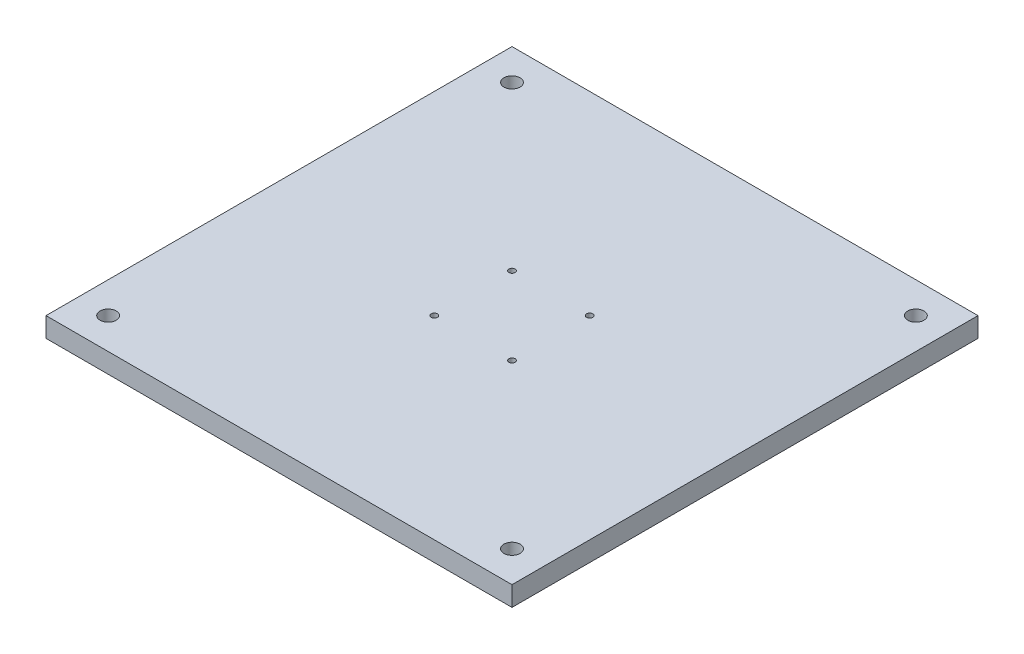
ISO-10303-21;
HEADER;
FILE_DESCRIPTION(('STEP AP214'),'2;1');
FILE_NAME('part.step','',(''),(''),'','','');
FILE_SCHEMA(('AUTOMOTIVE_DESIGN { 1 0 10303 214 1 1 1 1 }'));
ENDSEC;
DATA;
#1=APPLICATION_CONTEXT('core data for automotive mechanical design processes');
#2=APPLICATION_PROTOCOL_DEFINITION('international standard','automotive_design',2000,#1);
#3=PRODUCT_CONTEXT('',#1,'mechanical');
#4=PRODUCT('Part','Part','',(#3));
#5=PRODUCT_RELATED_PRODUCT_CATEGORY('part','',(#4));
#6=PRODUCT_DEFINITION_FORMATION('','',#4);
#7=PRODUCT_DEFINITION_CONTEXT('part definition',#1,'design');
#8=PRODUCT_DEFINITION('design','',#6,#7);
#9=PRODUCT_DEFINITION_SHAPE('','',#8);
#10=(LENGTH_UNIT() NAMED_UNIT(*) SI_UNIT(.MILLI.,.METRE.));
#11=(NAMED_UNIT(*) PLANE_ANGLE_UNIT() SI_UNIT($,.RADIAN.));
#12=(NAMED_UNIT(*) SI_UNIT($,.STERADIAN.) SOLID_ANGLE_UNIT());
#13=UNCERTAINTY_MEASURE_WITH_UNIT(LENGTH_MEASURE(1.E-05),#10,'distance_accuracy_value','');
#14=(GEOMETRIC_REPRESENTATION_CONTEXT(3) GLOBAL_UNCERTAINTY_ASSIGNED_CONTEXT((#13)) GLOBAL_UNIT_ASSIGNED_CONTEXT((#10,
#11,#12)) REPRESENTATION_CONTEXT('',''));
#15=CARTESIAN_POINT('',(0.,0.,0.));
#16=DIRECTION('',(0.,0.,1.));
#17=DIRECTION('',(1.,0.,0.));
#18=AXIS2_PLACEMENT_3D('',#15,#16,#17);
#19=CARTESIAN_POINT('',(0.,6.35,0.));
#20=DIRECTION('',(0.,1.,0.));
#21=DIRECTION('',(0.,0.,1.));
#22=AXIS2_PLACEMENT_3D('',#19,#20,#21);
#23=PLANE('',#22);
#24=CARTESIAN_POINT('',(12.5,6.35,12.5));
#25=DIRECTION('',(0.,1.,0.));
#26=DIRECTION('',(0.,0.,1.));
#27=AXIS2_PLACEMENT_3D('',#24,#25,#26);
#28=CIRCLE('',#27,1.00000000000001);
#29=CARTESIAN_POINT('',(12.5,6.35,13.5));
#30=VERTEX_POINT('',#29);
#31=EDGE_CURVE('E145',#30,#30,#28,.T.);
#32=ORIENTED_EDGE('',*,*,#31,.F.);
#33=EDGE_LOOP('',(#32));
#34=FACE_BOUND('',#33,.T.);
#35=CARTESIAN_POINT('',(-12.5,6.35,-12.5));
#36=DIRECTION('',(0.,1.,0.));
#37=DIRECTION('',(0.,0.,1.));
#38=AXIS2_PLACEMENT_3D('',#35,#36,#37);
#39=CIRCLE('',#38,0.999999999999998);
#40=CARTESIAN_POINT('',(-12.5,6.35,-11.5));
#41=VERTEX_POINT('',#40);
#42=EDGE_CURVE('E133',#41,#41,#39,.T.);
#43=ORIENTED_EDGE('',*,*,#42,.F.);
#44=EDGE_LOOP('',(#43));
#45=FACE_BOUND('',#44,.T.);
#46=CARTESIAN_POINT('',(65.,6.35,65.));
#47=DIRECTION('',(0.,1.,0.));
#48=DIRECTION('',(0.,0.,1.));
#49=AXIS2_PLACEMENT_3D('',#46,#47,#48);
#50=CIRCLE('',#49,2.59999999999999);
#51=CARTESIAN_POINT('',(65.,6.35,67.6));
#52=VERTEX_POINT('',#51);
#53=EDGE_CURVE('E121',#52,#52,#50,.T.);
#54=ORIENTED_EDGE('',*,*,#53,.F.);
#55=EDGE_LOOP('',(#54));
#56=FACE_BOUND('',#55,.T.);
#57=CARTESIAN_POINT('',(-65.,6.35,-65.));
#58=DIRECTION('',(0.,1.,0.));
#59=DIRECTION('',(0.,0.,1.));
#60=AXIS2_PLACEMENT_3D('',#57,#58,#59);
#61=CIRCLE('',#60,2.59999999999999);
#62=CARTESIAN_POINT('',(-65.,6.35,-62.4));
#63=VERTEX_POINT('',#62);
#64=EDGE_CURVE('E100',#63,#63,#61,.T.);
#65=ORIENTED_EDGE('',*,*,#64,.F.);
#66=EDGE_LOOP('',(#65));
#67=FACE_BOUND('',#66,.T.);
#68=DIRECTION('',(0.,0.,1.));
#69=VECTOR('',#68,1.);
#70=CARTESIAN_POINT('',(-75.,6.35,75.));
#71=LINE('',#70,#69);
#72=CARTESIAN_POINT('',(-75.,6.35,-75.));
#73=VERTEX_POINT('',#72);
#74=CARTESIAN_POINT('',(-75.,6.35,75.));
#75=VERTEX_POINT('',#74);
#76=EDGE_CURVE('E85',#73,#75,#71,.T.);
#77=ORIENTED_EDGE('',*,*,#76,.T.);
#78=DIRECTION('',(1.,0.,0.));
#79=VECTOR('',#78,1.);
#80=CARTESIAN_POINT('',(75.,6.35,75.));
#81=LINE('',#80,#79);
#82=CARTESIAN_POINT('',(75.,6.35,75.));
#83=VERTEX_POINT('',#82);
#84=EDGE_CURVE('E80',#75,#83,#81,.T.);
#85=ORIENTED_EDGE('',*,*,#84,.T.);
#86=DIRECTION('',(0.,0.,-1.));
#87=VECTOR('',#86,1.);
#88=CARTESIAN_POINT('',(75.,6.35,75.));
#89=LINE('',#88,#87);
#90=CARTESIAN_POINT('',(75.,6.35,-75.));
#91=VERTEX_POINT('',#90);
#92=EDGE_CURVE('E83',#83,#91,#89,.T.);
#93=ORIENTED_EDGE('',*,*,#92,.T.);
#94=DIRECTION('',(-1.,0.,0.));
#95=VECTOR('',#94,1.);
#96=CARTESIAN_POINT('',(75.,6.35,-75.));
#97=LINE('',#96,#95);
#98=EDGE_CURVE('E50',#91,#73,#97,.T.);
#99=ORIENTED_EDGE('',*,*,#98,.T.);
#100=EDGE_LOOP('',(#77,#85,#93,#99));
#101=FACE_BOUND('',#100,.T.);
#102=CARTESIAN_POINT('',(65.,6.35,-65.));
#103=DIRECTION('',(0.,1.,0.));
#104=DIRECTION('',(0.,0.,-1.));
#105=AXIS2_PLACEMENT_3D('',#102,#103,#104);
#106=CIRCLE('',#105,2.59999999999999);
#107=CARTESIAN_POINT('',(65.,6.35,-67.6));
#108=VERTEX_POINT('',#107);
#109=EDGE_CURVE('E115',#108,#108,#106,.T.);
#110=ORIENTED_EDGE('',*,*,#109,.F.);
#111=EDGE_LOOP('',(#110));
#112=FACE_BOUND('',#111,.T.);
#113=CARTESIAN_POINT('',(-65.,6.35,65.));
#114=DIRECTION('',(0.,1.,0.));
#115=DIRECTION('',(0.,0.,-1.));
#116=AXIS2_PLACEMENT_3D('',#113,#114,#115);
#117=CIRCLE('',#116,2.59999999999999);
#118=CARTESIAN_POINT('',(-65.,6.35,62.4));
#119=VERTEX_POINT('',#118);
#120=EDGE_CURVE('E127',#119,#119,#117,.T.);
#121=ORIENTED_EDGE('',*,*,#120,.F.);
#122=EDGE_LOOP('',(#121));
#123=FACE_BOUND('',#122,.T.);
#124=CARTESIAN_POINT('',(12.5,6.35,-12.5));
#125=DIRECTION('',(0.,1.,0.));
#126=DIRECTION('',(0.,0.,-1.));
#127=AXIS2_PLACEMENT_3D('',#124,#125,#126);
#128=CIRCLE('',#127,0.999999999999998);
#129=CARTESIAN_POINT('',(12.5,6.35,-13.5));
#130=VERTEX_POINT('',#129);
#131=EDGE_CURVE('E139',#130,#130,#128,.T.);
#132=ORIENTED_EDGE('',*,*,#131,.F.);
#133=EDGE_LOOP('',(#132));
#134=FACE_BOUND('',#133,.T.);
#135=CARTESIAN_POINT('',(-12.5,6.35,12.5));
#136=DIRECTION('',(0.,1.,0.));
#137=DIRECTION('',(0.,0.,-1.));
#138=AXIS2_PLACEMENT_3D('',#135,#136,#137);
#139=CIRCLE('',#138,1.00000000000001);
#140=CARTESIAN_POINT('',(-12.5,6.35,11.5));
#141=VERTEX_POINT('',#140);
#142=EDGE_CURVE('E151',#141,#141,#139,.T.);
#143=ORIENTED_EDGE('',*,*,#142,.F.);
#144=EDGE_LOOP('',(#143));
#145=FACE_BOUND('',#144,.T.);
#146=ADVANCED_FACE('F33',(#34,#45,#56,#67,#101,#112,#123,#134,#145),#23,.T.);
#147=CARTESIAN_POINT('',(0.,0.,0.));
#148=DIRECTION('',(0.,1.,0.));
#149=DIRECTION('',(0.,0.,1.));
#150=AXIS2_PLACEMENT_3D('',#147,#148,#149);
#151=PLANE('',#150);
#152=CARTESIAN_POINT('',(12.5,0.,12.5));
#153=DIRECTION('',(0.,1.,0.));
#154=DIRECTION('',(0.,0.,1.));
#155=AXIS2_PLACEMENT_3D('',#152,#153,#154);
#156=CIRCLE('',#155,1.00000000000001);
#157=CARTESIAN_POINT('',(12.5,0.,13.5));
#158=VERTEX_POINT('',#157);
#159=EDGE_CURVE('E148',#158,#158,#156,.T.);
#160=ORIENTED_EDGE('',*,*,#159,.T.);
#161=EDGE_LOOP('',(#160));
#162=FACE_BOUND('',#161,.T.);
#163=CARTESIAN_POINT('',(-12.5,0.,-12.5));
#164=DIRECTION('',(0.,1.,0.));
#165=DIRECTION('',(0.,0.,1.));
#166=AXIS2_PLACEMENT_3D('',#163,#164,#165);
#167=CIRCLE('',#166,0.999999999999998);
#168=CARTESIAN_POINT('',(-12.5,0.,-11.5));
#169=VERTEX_POINT('',#168);
#170=EDGE_CURVE('E136',#169,#169,#167,.T.);
#171=ORIENTED_EDGE('',*,*,#170,.T.);
#172=EDGE_LOOP('',(#171));
#173=FACE_BOUND('',#172,.T.);
#174=CARTESIAN_POINT('',(65.,0.,65.));
#175=DIRECTION('',(0.,1.,0.));
#176=DIRECTION('',(0.,0.,1.));
#177=AXIS2_PLACEMENT_3D('',#174,#175,#176);
#178=CIRCLE('',#177,2.59999999999999);
#179=CARTESIAN_POINT('',(65.,0.,67.6));
#180=VERTEX_POINT('',#179);
#181=EDGE_CURVE('E124',#180,#180,#178,.T.);
#182=ORIENTED_EDGE('',*,*,#181,.T.);
#183=EDGE_LOOP('',(#182));
#184=FACE_BOUND('',#183,.T.);
#185=CARTESIAN_POINT('',(-65.,0.,-65.));
#186=DIRECTION('',(0.,1.,0.));
#187=DIRECTION('',(0.,0.,1.));
#188=AXIS2_PLACEMENT_3D('',#185,#186,#187);
#189=CIRCLE('',#188,2.59999999999999);
#190=CARTESIAN_POINT('',(-65.,0.,-62.4));
#191=VERTEX_POINT('',#190);
#192=EDGE_CURVE('E112',#191,#191,#189,.T.);
#193=ORIENTED_EDGE('',*,*,#192,.T.);
#194=EDGE_LOOP('',(#193));
#195=FACE_BOUND('',#194,.T.);
#196=DIRECTION('',(0.,0.,1.));
#197=VECTOR('',#196,1.);
#198=CARTESIAN_POINT('',(-75.,0.,75.));
#199=LINE('',#198,#197);
#200=CARTESIAN_POINT('',(-75.,0.,-75.));
#201=VERTEX_POINT('',#200);
#202=CARTESIAN_POINT('',(-75.,0.,75.));
#203=VERTEX_POINT('',#202);
#204=EDGE_CURVE('E97',#201,#203,#199,.T.);
#205=ORIENTED_EDGE('',*,*,#204,.F.);
#206=DIRECTION('',(-1.,0.,0.));
#207=VECTOR('',#206,1.);
#208=CARTESIAN_POINT('',(75.,0.,-75.));
#209=LINE('',#208,#207);
#210=CARTESIAN_POINT('',(75.,0.,-75.));
#211=VERTEX_POINT('',#210);
#212=EDGE_CURVE('E73',#211,#201,#209,.T.);
#213=ORIENTED_EDGE('',*,*,#212,.F.);
#214=DIRECTION('',(0.,0.,-1.));
#215=VECTOR('',#214,1.);
#216=CARTESIAN_POINT('',(75.,0.,75.));
#217=LINE('',#216,#215);
#218=CARTESIAN_POINT('',(75.,0.,75.));
#219=VERTEX_POINT('',#218);
#220=EDGE_CURVE('E67',#219,#211,#217,.T.);
#221=ORIENTED_EDGE('',*,*,#220,.F.);
#222=DIRECTION('',(1.,0.,0.));
#223=VECTOR('',#222,1.);
#224=CARTESIAN_POINT('',(75.,0.,75.));
#225=LINE('',#224,#223);
#226=EDGE_CURVE('E89',#203,#219,#225,.T.);
#227=ORIENTED_EDGE('',*,*,#226,.F.);
#228=EDGE_LOOP('',(#205,#213,#221,#227));
#229=FACE_BOUND('',#228,.T.);
#230=CARTESIAN_POINT('',(65.,0.,-65.));
#231=DIRECTION('',(0.,1.,0.));
#232=DIRECTION('',(0.,0.,-1.));
#233=AXIS2_PLACEMENT_3D('',#230,#231,#232);
#234=CIRCLE('',#233,2.59999999999999);
#235=CARTESIAN_POINT('',(65.,0.,-67.6));
#236=VERTEX_POINT('',#235);
#237=EDGE_CURVE('E118',#236,#236,#234,.T.);
#238=ORIENTED_EDGE('',*,*,#237,.T.);
#239=EDGE_LOOP('',(#238));
#240=FACE_BOUND('',#239,.T.);
#241=CARTESIAN_POINT('',(-65.,0.,65.));
#242=DIRECTION('',(0.,1.,0.));
#243=DIRECTION('',(0.,0.,-1.));
#244=AXIS2_PLACEMENT_3D('',#241,#242,#243);
#245=CIRCLE('',#244,2.59999999999999);
#246=CARTESIAN_POINT('',(-65.,0.,62.4));
#247=VERTEX_POINT('',#246);
#248=EDGE_CURVE('E130',#247,#247,#245,.T.);
#249=ORIENTED_EDGE('',*,*,#248,.T.);
#250=EDGE_LOOP('',(#249));
#251=FACE_BOUND('',#250,.T.);
#252=CARTESIAN_POINT('',(12.5,0.,-12.5));
#253=DIRECTION('',(0.,1.,0.));
#254=DIRECTION('',(0.,0.,-1.));
#255=AXIS2_PLACEMENT_3D('',#252,#253,#254);
#256=CIRCLE('',#255,0.999999999999998);
#257=CARTESIAN_POINT('',(12.5,0.,-13.5));
#258=VERTEX_POINT('',#257);
#259=EDGE_CURVE('E142',#258,#258,#256,.T.);
#260=ORIENTED_EDGE('',*,*,#259,.T.);
#261=EDGE_LOOP('',(#260));
#262=FACE_BOUND('',#261,.T.);
#263=CARTESIAN_POINT('',(-12.5,0.,12.5));
#264=DIRECTION('',(0.,1.,0.));
#265=DIRECTION('',(0.,0.,-1.));
#266=AXIS2_PLACEMENT_3D('',#263,#264,#265);
#267=CIRCLE('',#266,1.00000000000001);
#268=CARTESIAN_POINT('',(-12.5,0.,11.5));
#269=VERTEX_POINT('',#268);
#270=EDGE_CURVE('E154',#269,#269,#267,.T.);
#271=ORIENTED_EDGE('',*,*,#270,.T.);
#272=EDGE_LOOP('',(#271));
#273=FACE_BOUND('',#272,.T.);
#274=ADVANCED_FACE('F108',(#162,#173,#184,#195,#229,#240,#251,#262,#273),#151,.F.);
#275=CARTESIAN_POINT('',(-75.,6.35,75.));
#276=DIRECTION('',(1.,0.,0.));
#277=DIRECTION('',(0.,0.,-1.));
#278=AXIS2_PLACEMENT_3D('',#275,#276,#277);
#279=PLANE('',#278);
#280=ORIENTED_EDGE('',*,*,#204,.T.);
#281=DIRECTION('',(0.,-1.,0.));
#282=VECTOR('',#281,1.);
#283=CARTESIAN_POINT('',(-75.,6.35,75.));
#284=LINE('',#283,#282);
#285=EDGE_CURVE('E11',#75,#203,#284,.T.);
#286=ORIENTED_EDGE('',*,*,#285,.F.);
#287=ORIENTED_EDGE('',*,*,#76,.F.);
#288=DIRECTION('',(0.,-1.,0.));
#289=VECTOR('',#288,1.);
#290=CARTESIAN_POINT('',(-75.,6.35,-75.));
#291=LINE('',#290,#289);
#292=EDGE_CURVE('E93',#73,#201,#291,.T.);
#293=ORIENTED_EDGE('',*,*,#292,.T.);
#294=EDGE_LOOP('',(#280,#286,#287,#293));
#295=FACE_BOUND('',#294,.T.);
#296=ADVANCED_FACE('F35',(#295),#279,.F.);
#297=CARTESIAN_POINT('',(75.,6.35,75.));
#298=DIRECTION('',(0.,0.,-1.));
#299=DIRECTION('',(-1.,0.,0.));
#300=AXIS2_PLACEMENT_3D('',#297,#298,#299);
#301=PLANE('',#300);
#302=ORIENTED_EDGE('',*,*,#226,.T.);
#303=DIRECTION('',(0.,-1.,0.));
#304=VECTOR('',#303,1.);
#305=CARTESIAN_POINT('',(75.,6.35,75.));
#306=LINE('',#305,#304);
#307=EDGE_CURVE('E42',#83,#219,#306,.T.);
#308=ORIENTED_EDGE('',*,*,#307,.F.);
#309=ORIENTED_EDGE('',*,*,#84,.F.);
#310=ORIENTED_EDGE('',*,*,#285,.T.);
#311=EDGE_LOOP('',(#302,#308,#309,#310));
#312=FACE_BOUND('',#311,.T.);
#313=ADVANCED_FACE('F88',(#312),#301,.F.);
#314=CARTESIAN_POINT('',(75.,6.35,75.));
#315=DIRECTION('',(-1.,0.,0.));
#316=DIRECTION('',(0.,0.,1.));
#317=AXIS2_PLACEMENT_3D('',#314,#315,#316);
#318=PLANE('',#317);
#319=ORIENTED_EDGE('',*,*,#220,.T.);
#320=DIRECTION('',(0.,-1.,0.));
#321=VECTOR('',#320,1.);
#322=CARTESIAN_POINT('',(75.,6.35,-75.));
#323=LINE('',#322,#321);
#324=EDGE_CURVE('E90',#91,#211,#323,.T.);
#325=ORIENTED_EDGE('',*,*,#324,.F.);
#326=ORIENTED_EDGE('',*,*,#92,.F.);
#327=ORIENTED_EDGE('',*,*,#307,.T.);
#328=EDGE_LOOP('',(#319,#325,#326,#327));
#329=FACE_BOUND('',#328,.T.);
#330=ADVANCED_FACE('F91',(#329),#318,.F.);
#331=CARTESIAN_POINT('',(75.,6.35,-75.));
#332=DIRECTION('',(0.,0.,1.));
#333=DIRECTION('',(1.,0.,0.));
#334=AXIS2_PLACEMENT_3D('',#331,#332,#333);
#335=PLANE('',#334);
#336=ORIENTED_EDGE('',*,*,#212,.T.);
#337=ORIENTED_EDGE('',*,*,#292,.F.);
#338=ORIENTED_EDGE('',*,*,#98,.F.);
#339=ORIENTED_EDGE('',*,*,#324,.T.);
#340=EDGE_LOOP('',(#336,#337,#338,#339));
#341=FACE_BOUND('',#340,.T.);
#342=ADVANCED_FACE('F105',(#341),#335,.F.);
#343=CARTESIAN_POINT('',(-65.,6.35,-65.));
#344=DIRECTION('',(0.,-1.,0.));
#345=DIRECTION('',(0.,0.,-1.));
#346=AXIS2_PLACEMENT_3D('',#343,#344,#345);
#347=CYLINDRICAL_SURFACE('',#346,2.59999999999999);
#348=ORIENTED_EDGE('',*,*,#64,.T.);
#349=EDGE_LOOP('',(#348));
#350=FACE_BOUND('',#349,.T.);
#351=ORIENTED_EDGE('',*,*,#192,.F.);
#352=EDGE_LOOP('',(#351));
#353=FACE_BOUND('',#352,.T.);
#354=ADVANCED_FACE('F174',(#350,#353),#347,.F.);
#355=CARTESIAN_POINT('',(65.,6.35,-65.));
#356=DIRECTION('',(0.,-1.,0.));
#357=DIRECTION('',(0.,0.,-1.));
#358=AXIS2_PLACEMENT_3D('',#355,#356,#357);
#359=CYLINDRICAL_SURFACE('',#358,2.59999999999999);
#360=ORIENTED_EDGE('',*,*,#109,.T.);
#361=EDGE_LOOP('',(#360));
#362=FACE_BOUND('',#361,.T.);
#363=ORIENTED_EDGE('',*,*,#237,.F.);
#364=EDGE_LOOP('',(#363));
#365=FACE_BOUND('',#364,.T.);
#366=ADVANCED_FACE('F220',(#362,#365),#359,.F.);
#367=CARTESIAN_POINT('',(65.,6.35,65.));
#368=DIRECTION('',(0.,-1.,0.));
#369=DIRECTION('',(0.,0.,-1.));
#370=AXIS2_PLACEMENT_3D('',#367,#368,#369);
#371=CYLINDRICAL_SURFACE('',#370,2.59999999999999);
#372=ORIENTED_EDGE('',*,*,#53,.T.);
#373=EDGE_LOOP('',(#372));
#374=FACE_BOUND('',#373,.T.);
#375=ORIENTED_EDGE('',*,*,#181,.F.);
#376=EDGE_LOOP('',(#375));
#377=FACE_BOUND('',#376,.T.);
#378=ADVANCED_FACE('F228',(#374,#377),#371,.F.);
#379=CARTESIAN_POINT('',(-65.,6.35,65.));
#380=DIRECTION('',(0.,-1.,0.));
#381=DIRECTION('',(0.,0.,-1.));
#382=AXIS2_PLACEMENT_3D('',#379,#380,#381);
#383=CYLINDRICAL_SURFACE('',#382,2.59999999999999);
#384=ORIENTED_EDGE('',*,*,#120,.T.);
#385=EDGE_LOOP('',(#384));
#386=FACE_BOUND('',#385,.T.);
#387=ORIENTED_EDGE('',*,*,#248,.F.);
#388=EDGE_LOOP('',(#387));
#389=FACE_BOUND('',#388,.T.);
#390=ADVANCED_FACE('F236',(#386,#389),#383,.F.);
#391=CARTESIAN_POINT('',(-12.5,6.35,-12.5));
#392=DIRECTION('',(0.,-1.,0.));
#393=DIRECTION('',(0.,0.,-1.));
#394=AXIS2_PLACEMENT_3D('',#391,#392,#393);
#395=CYLINDRICAL_SURFACE('',#394,0.999999999999998);
#396=ORIENTED_EDGE('',*,*,#42,.T.);
#397=EDGE_LOOP('',(#396));
#398=FACE_BOUND('',#397,.T.);
#399=ORIENTED_EDGE('',*,*,#170,.F.);
#400=EDGE_LOOP('',(#399));
#401=FACE_BOUND('',#400,.T.);
#402=ADVANCED_FACE('F245',(#398,#401),#395,.F.);
#403=CARTESIAN_POINT('',(12.5,6.35,-12.5));
#404=DIRECTION('',(0.,-1.,0.));
#405=DIRECTION('',(0.,0.,-1.));
#406=AXIS2_PLACEMENT_3D('',#403,#404,#405);
#407=CYLINDRICAL_SURFACE('',#406,0.999999999999998);
#408=ORIENTED_EDGE('',*,*,#131,.T.);
#409=EDGE_LOOP('',(#408));
#410=FACE_BOUND('',#409,.T.);
#411=ORIENTED_EDGE('',*,*,#259,.F.);
#412=EDGE_LOOP('',(#411));
#413=FACE_BOUND('',#412,.T.);
#414=ADVANCED_FACE('F254',(#410,#413),#407,.F.);
#415=CARTESIAN_POINT('',(12.5,6.35,12.5));
#416=DIRECTION('',(0.,-1.,0.));
#417=DIRECTION('',(0.,0.,-1.));
#418=AXIS2_PLACEMENT_3D('',#415,#416,#417);
#419=CYLINDRICAL_SURFACE('',#418,1.00000000000001);
#420=ORIENTED_EDGE('',*,*,#31,.T.);
#421=EDGE_LOOP('',(#420));
#422=FACE_BOUND('',#421,.T.);
#423=ORIENTED_EDGE('',*,*,#159,.F.);
#424=EDGE_LOOP('',(#423));
#425=FACE_BOUND('',#424,.T.);
#426=ADVANCED_FACE('F263',(#422,#425),#419,.F.);
#427=CARTESIAN_POINT('',(-12.5,6.35,12.5));
#428=DIRECTION('',(0.,-1.,0.));
#429=DIRECTION('',(0.,0.,-1.));
#430=AXIS2_PLACEMENT_3D('',#427,#428,#429);
#431=CYLINDRICAL_SURFACE('',#430,1.00000000000001);
#432=ORIENTED_EDGE('',*,*,#142,.T.);
#433=EDGE_LOOP('',(#432));
#434=FACE_BOUND('',#433,.T.);
#435=ORIENTED_EDGE('',*,*,#270,.F.);
#436=EDGE_LOOP('',(#435));
#437=FACE_BOUND('',#436,.T.);
#438=ADVANCED_FACE('F160',(#434,#437),#431,.F.);
#439=CLOSED_SHELL('',(#146,#274,#296,#313,#330,#342,#354,#366,#378,#390,#402,#414,#426,#438));
#440=MANIFOLD_SOLID_BREP('B2',#439);
#441=ADVANCED_BREP_SHAPE_REPRESENTATION('',(#18,#440),#14);
#442=SHAPE_DEFINITION_REPRESENTATION(#9,#441);
ENDSEC;
END-ISO-10303-21;
